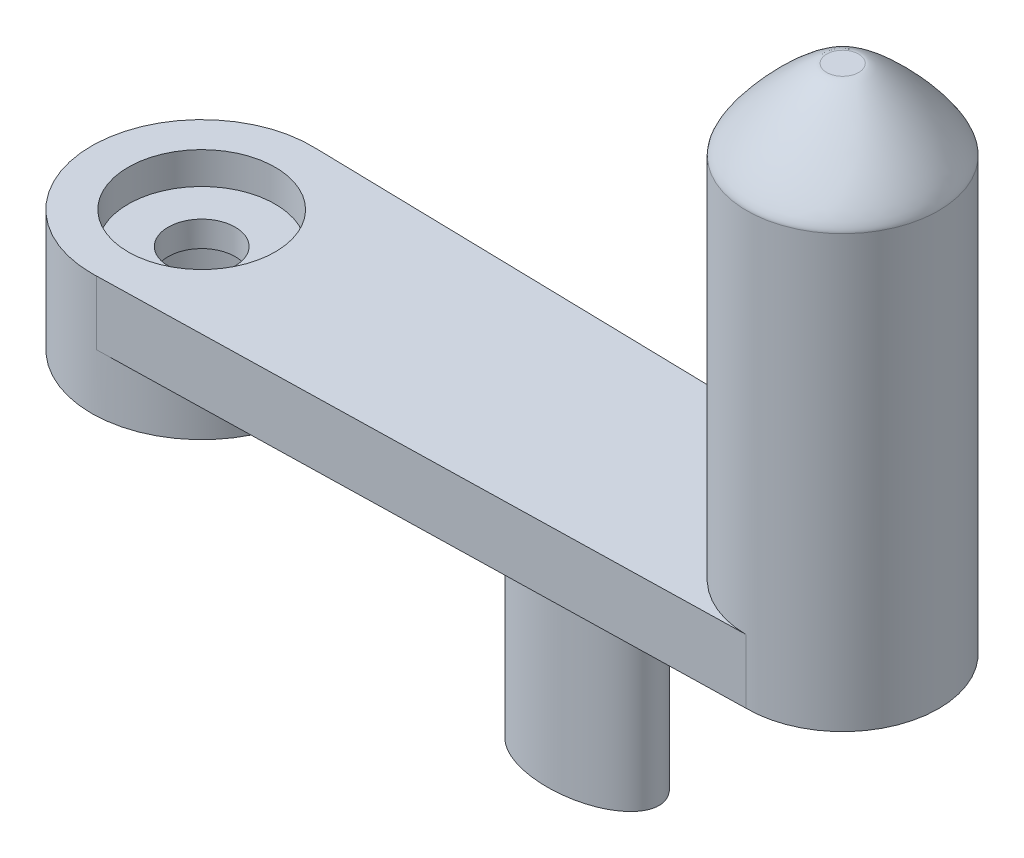
ISO-10303-21;
HEADER;
FILE_DESCRIPTION(('STEP AP214'),'2;1');
FILE_NAME('part.step','',(''),(''),'','','');
FILE_SCHEMA(('AUTOMOTIVE_DESIGN { 1 0 10303 214 1 1 1 1 }'));
ENDSEC;
DATA;
#1=APPLICATION_CONTEXT('core data for automotive mechanical design processes');
#2=APPLICATION_PROTOCOL_DEFINITION('international standard','automotive_design',2000,#1);
#3=PRODUCT_CONTEXT('',#1,'mechanical');
#4=PRODUCT('Part','Part','',(#3));
#5=PRODUCT_RELATED_PRODUCT_CATEGORY('part','',(#4));
#6=PRODUCT_DEFINITION_FORMATION('','',#4);
#7=PRODUCT_DEFINITION_CONTEXT('part definition',#1,'design');
#8=PRODUCT_DEFINITION('design','',#6,#7);
#9=PRODUCT_DEFINITION_SHAPE('','',#8);
#10=(LENGTH_UNIT() NAMED_UNIT(*) SI_UNIT(.MILLI.,.METRE.));
#11=(NAMED_UNIT(*) PLANE_ANGLE_UNIT() SI_UNIT($,.RADIAN.));
#12=(NAMED_UNIT(*) SI_UNIT($,.STERADIAN.) SOLID_ANGLE_UNIT());
#13=UNCERTAINTY_MEASURE_WITH_UNIT(LENGTH_MEASURE(1.E-05),#10,'distance_accuracy_value','');
#14=(GEOMETRIC_REPRESENTATION_CONTEXT(3) GLOBAL_UNCERTAINTY_ASSIGNED_CONTEXT((#13)) GLOBAL_UNIT_ASSIGNED_CONTEXT((#10,
#11,#12)) REPRESENTATION_CONTEXT('',''));
#15=CARTESIAN_POINT('',(0.,0.,0.));
#16=DIRECTION('',(0.,0.,1.));
#17=DIRECTION('',(1.,0.,0.));
#18=AXIS2_PLACEMENT_3D('',#15,#16,#17);
#19=CARTESIAN_POINT('',(0.,-1.4,0.));
#20=DIRECTION('',(0.,1.,0.));
#21=DIRECTION('',(0.,0.,1.));
#22=AXIS2_PLACEMENT_3D('',#19,#20,#21);
#23=CYLINDRICAL_SURFACE('',#22,3.45);
#24=DIRECTION('',(0.,1.,0.));
#25=VECTOR('',#24,1.);
#26=CARTESIAN_POINT('',(0.154910768884006,-2.,3.44652036896401));
#27=LINE('',#26,#25);
#28=CARTESIAN_POINT('',(0.154910768884006,-2.,3.44652036896401));
#29=VERTEX_POINT('',#28);
#30=CARTESIAN_POINT('',(0.154910768884006,0.,3.44652036896401));
#31=VERTEX_POINT('',#30);
#32=EDGE_CURVE('E82',#29,#31,#27,.T.);
#33=ORIENTED_EDGE('',*,*,#32,.T.);
#34=CARTESIAN_POINT('',(0.,0.,0.));
#35=DIRECTION('',(0.,1.,0.));
#36=DIRECTION('',(0.,0.,1.));
#37=AXIS2_PLACEMENT_3D('',#34,#35,#36);
#38=CIRCLE('',#37,3.45);
#39=CARTESIAN_POINT('',(0.154910768884048,0.,-3.44652036896399));
#40=VERTEX_POINT('',#39);
#41=EDGE_CURVE('E165',#40,#31,#38,.T.);
#42=ORIENTED_EDGE('',*,*,#41,.F.);
#43=DIRECTION('',(0.,1.,0.));
#44=VECTOR('',#43,1.);
#45=CARTESIAN_POINT('',(0.154910768884006,-2.,-3.446520368964));
#46=LINE('',#45,#44);
#47=CARTESIAN_POINT('',(0.154910768884006,-2.,-3.446520368964));
#48=VERTEX_POINT('',#47);
#49=EDGE_CURVE('E124',#48,#40,#46,.T.);
#50=ORIENTED_EDGE('',*,*,#49,.F.);
#51=CARTESIAN_POINT('',(0.,-2.,0.));
#52=DIRECTION('',(0.,1.,0.));
#53=DIRECTION('',(0.,0.,1.));
#54=AXIS2_PLACEMENT_3D('',#51,#52,#53);
#55=CIRCLE('',#54,3.45);
#56=EDGE_CURVE('E125',#29,#48,#55,.T.);
#57=ORIENTED_EDGE('',*,*,#56,.F.);
#58=EDGE_LOOP('',(#33,#42,#50,#57));
#59=FACE_BOUND('',#58,.T.);
#60=CARTESIAN_POINT('',(0.,-3.8,0.));
#61=DIRECTION('',(0.,1.,0.));
#62=DIRECTION('',(0.,0.,1.));
#63=AXIS2_PLACEMENT_3D('',#60,#61,#62);
#64=CIRCLE('',#63,3.45);
#65=CARTESIAN_POINT('',(0.,-3.8,3.45));
#66=VERTEX_POINT('',#65);
#67=EDGE_CURVE('E161',#66,#66,#64,.T.);
#68=ORIENTED_EDGE('',*,*,#67,.T.);
#69=EDGE_LOOP('',(#68));
#70=FACE_BOUND('',#69,.T.);
#71=ADVANCED_FACE('F51',(#59,#70),#23,.T.);
#72=CARTESIAN_POINT('',(0.,0.,0.));
#73=DIRECTION('',(0.,1.,0.));
#74=DIRECTION('',(0.,0.,1.));
#75=AXIS2_PLACEMENT_3D('',#72,#73,#74);
#76=PLANE('',#75);
#77=CARTESIAN_POINT('',(20.0673694973812,0.,0.));
#78=DIRECTION('',(0.,1.,0.));
#79=DIRECTION('',(0.,0.,1.));
#80=AXIS2_PLACEMENT_3D('',#77,#78,#79);
#81=CIRCLE('',#80,3.);
#82=CARTESIAN_POINT('',(20.0394661995052,0.,-2.99987023152129));
#83=VERTEX_POINT('',#82);
#84=CARTESIAN_POINT('',(20.0394661995052,0.,2.99987023152131));
#85=VERTEX_POINT('',#84);
#86=EDGE_CURVE('E97',#83,#85,#81,.T.);
#87=ORIENTED_EDGE('',*,*,#86,.F.);
#88=DIRECTION('',(0.999747821026361,0.,0.0224564991270473));
#89=VECTOR('',#88,1.);
#90=CARTESIAN_POINT('',(0.0774553844420066,0.,-3.44826018448199));
#91=LINE('',#90,#89);
#92=EDGE_CURVE('E73',#40,#83,#91,.T.);
#93=ORIENTED_EDGE('',*,*,#92,.F.);
#94=ORIENTED_EDGE('',*,*,#41,.T.);
#95=DIRECTION('',(0.999747821026361,0.,-0.0224564991270473));
#96=VECTOR('',#95,1.);
#97=CARTESIAN_POINT('',(0.0774553844420066,0.,3.44826018448201));
#98=LINE('',#97,#96);
#99=EDGE_CURVE('E91',#31,#85,#98,.T.);
#100=ORIENTED_EDGE('',*,*,#99,.T.);
#101=EDGE_LOOP('',(#87,#93,#94,#100));
#102=FACE_BOUND('',#101,.T.);
#103=CARTESIAN_POINT('',(0.,0.,0.));
#104=DIRECTION('',(0.,1.,0.));
#105=DIRECTION('',(0.,0.,1.));
#106=AXIS2_PLACEMENT_3D('',#103,#104,#105);
#107=CIRCLE('',#106,2.30000000000001);
#108=CARTESIAN_POINT('',(0.,0.,2.30000000000001));
#109=VERTEX_POINT('',#108);
#110=EDGE_CURVE('E145',#109,#109,#107,.T.);
#111=ORIENTED_EDGE('',*,*,#110,.F.);
#112=EDGE_LOOP('',(#111));
#113=FACE_BOUND('',#112,.T.);
#114=ADVANCED_FACE('F228',(#102,#113),#76,.T.);
#115=CARTESIAN_POINT('',(0.,-3.8,0.));
#116=DIRECTION('',(0.,1.,0.));
#117=DIRECTION('',(0.,0.,1.));
#118=AXIS2_PLACEMENT_3D('',#115,#116,#117);
#119=PLANE('',#118);
#120=CARTESIAN_POINT('',(0.,-3.8,0.));
#121=DIRECTION('',(0.,-1.,0.));
#122=DIRECTION('',(0.,0.,-1.));
#123=AXIS2_PLACEMENT_3D('',#120,#121,#122);
#124=CIRCLE('',#123,2.47500000000001);
#125=CARTESIAN_POINT('',(0.,-3.8,-2.47500000000001));
#126=VERTEX_POINT('',#125);
#127=EDGE_CURVE('E153',#126,#126,#124,.T.);
#128=ORIENTED_EDGE('',*,*,#127,.F.);
#129=EDGE_LOOP('',(#128));
#130=FACE_BOUND('',#129,.T.);
#131=ORIENTED_EDGE('',*,*,#67,.F.);
#132=EDGE_LOOP('',(#131));
#133=FACE_BOUND('',#132,.T.);
#134=ADVANCED_FACE('F224',(#130,#133),#119,.F.);
#135=CARTESIAN_POINT('',(0.,-1.8,0.));
#136=DIRECTION('',(0.,1.,0.));
#137=DIRECTION('',(0.,0.,1.));
#138=AXIS2_PLACEMENT_3D('',#135,#136,#137);
#139=PLANE('',#138);
#140=CARTESIAN_POINT('',(0.,-1.8,0.));
#141=DIRECTION('',(0.,1.,0.));
#142=DIRECTION('',(0.,0.,1.));
#143=AXIS2_PLACEMENT_3D('',#140,#141,#142);
#144=CIRCLE('',#143,1.05000000000001);
#145=CARTESIAN_POINT('',(0.,-1.8,1.05000000000001));
#146=VERTEX_POINT('',#145);
#147=EDGE_CURVE('E141',#146,#146,#144,.T.);
#148=ORIENTED_EDGE('',*,*,#147,.T.);
#149=EDGE_LOOP('',(#148));
#150=FACE_BOUND('',#149,.T.);
#151=CARTESIAN_POINT('',(0.,-1.8,0.));
#152=DIRECTION('',(0.,-1.,0.));
#153=DIRECTION('',(0.,0.,-1.));
#154=AXIS2_PLACEMENT_3D('',#151,#152,#153);
#155=CIRCLE('',#154,2.47500000000001);
#156=CARTESIAN_POINT('',(0.,-1.8,-2.47500000000001));
#157=VERTEX_POINT('',#156);
#158=EDGE_CURVE('E157',#157,#157,#155,.T.);
#159=ORIENTED_EDGE('',*,*,#158,.T.);
#160=EDGE_LOOP('',(#159));
#161=FACE_BOUND('',#160,.T.);
#162=ADVANCED_FACE('F220',(#150,#161),#139,.F.);
#163=CARTESIAN_POINT('',(0.,-3.8,0.));
#164=DIRECTION('',(0.,-1.,0.));
#165=DIRECTION('',(0.,0.,-1.));
#166=AXIS2_PLACEMENT_3D('',#163,#164,#165);
#167=CYLINDRICAL_SURFACE('',#166,2.47500000000001);
#168=ORIENTED_EDGE('',*,*,#158,.F.);
#169=EDGE_LOOP('',(#168));
#170=FACE_BOUND('',#169,.T.);
#171=ORIENTED_EDGE('',*,*,#127,.T.);
#172=EDGE_LOOP('',(#171));
#173=FACE_BOUND('',#172,.T.);
#174=ADVANCED_FACE('F216',(#170,#173),#167,.F.);
#175=CARTESIAN_POINT('',(0.,-1.,0.));
#176=DIRECTION('',(0.,-1.,0.));
#177=DIRECTION('',(0.,0.,-1.));
#178=AXIS2_PLACEMENT_3D('',#175,#176,#177);
#179=PLANE('',#178);
#180=CARTESIAN_POINT('',(0.,-1.,0.));
#181=DIRECTION('',(0.,-1.,0.));
#182=DIRECTION('',(0.,0.,-1.));
#183=AXIS2_PLACEMENT_3D('',#180,#181,#182);
#184=CIRCLE('',#183,1.05000000000001);
#185=CARTESIAN_POINT('',(0.,-1.,-1.05000000000001));
#186=VERTEX_POINT('',#185);
#187=EDGE_CURVE('E139',#186,#186,#184,.T.);
#188=ORIENTED_EDGE('',*,*,#187,.T.);
#189=EDGE_LOOP('',(#188));
#190=FACE_BOUND('',#189,.T.);
#191=CARTESIAN_POINT('',(0.,-1.,0.));
#192=DIRECTION('',(0.,1.,0.));
#193=DIRECTION('',(0.,0.,1.));
#194=AXIS2_PLACEMENT_3D('',#191,#192,#193);
#195=CIRCLE('',#194,2.30000000000001);
#196=CARTESIAN_POINT('',(0.,-1.,2.30000000000001));
#197=VERTEX_POINT('',#196);
#198=EDGE_CURVE('E149',#197,#197,#195,.T.);
#199=ORIENTED_EDGE('',*,*,#198,.T.);
#200=EDGE_LOOP('',(#199));
#201=FACE_BOUND('',#200,.T.);
#202=ADVANCED_FACE('F212',(#190,#201),#179,.F.);
#203=CARTESIAN_POINT('',(0.,0.,0.));
#204=DIRECTION('',(0.,1.,0.));
#205=DIRECTION('',(0.,0.,1.));
#206=AXIS2_PLACEMENT_3D('',#203,#204,#205);
#207=CYLINDRICAL_SURFACE('',#206,2.30000000000001);
#208=ORIENTED_EDGE('',*,*,#198,.F.);
#209=EDGE_LOOP('',(#208));
#210=FACE_BOUND('',#209,.T.);
#211=ORIENTED_EDGE('',*,*,#110,.T.);
#212=EDGE_LOOP('',(#211));
#213=FACE_BOUND('',#212,.T.);
#214=ADVANCED_FACE('F208',(#210,#213),#207,.F.);
#215=CARTESIAN_POINT('',(0.,0.,0.));
#216=DIRECTION('',(0.,1.,0.));
#217=DIRECTION('',(0.,0.,1.));
#218=AXIS2_PLACEMENT_3D('',#215,#216,#217);
#219=CYLINDRICAL_SURFACE('',#218,1.05000000000001);
#220=ORIENTED_EDGE('',*,*,#187,.F.);
#221=EDGE_LOOP('',(#220));
#222=FACE_BOUND('',#221,.T.);
#223=ORIENTED_EDGE('',*,*,#147,.F.);
#224=EDGE_LOOP('',(#223));
#225=FACE_BOUND('',#224,.T.);
#226=ADVANCED_FACE('F202',(#222,#225),#219,.F.);
#227=CARTESIAN_POINT('',(0.0774553844420066,-2.,3.44826018448201));
#228=DIRECTION('',(0.0224564991270473,0.,0.999747821026361));
#229=DIRECTION('',(0.999747821026361,0.,-0.0224564991270473));
#230=AXIS2_PLACEMENT_3D('',#227,#228,#229);
#231=PLANE('',#230);
#232=DIRECTION('',(0.,-1.,0.));
#233=VECTOR('',#232,1.);
#234=CARTESIAN_POINT('',(20.0394661995052,14.,2.9998702315213));
#235=LINE('',#234,#233);
#236=CARTESIAN_POINT('',(20.0394661995052,-2.,2.99987023152131));
#237=VERTEX_POINT('',#236);
#238=EDGE_CURVE('E104',#85,#237,#235,.T.);
#239=ORIENTED_EDGE('',*,*,#238,.F.);
#240=ORIENTED_EDGE('',*,*,#99,.F.);
#241=ORIENTED_EDGE('',*,*,#32,.F.);
#242=DIRECTION('',(0.999747821026361,0.,-0.0224564991270473));
#243=VECTOR('',#242,1.);
#244=CARTESIAN_POINT('',(0.0774553844420066,-2.,3.44826018448201));
#245=LINE('',#244,#243);
#246=EDGE_CURVE('E114',#29,#237,#245,.T.);
#247=ORIENTED_EDGE('',*,*,#246,.T.);
#248=EDGE_LOOP('',(#239,#240,#241,#247));
#249=FACE_BOUND('',#248,.T.);
#250=ADVANCED_FACE('F122',(#249),#231,.T.);
#251=CARTESIAN_POINT('',(0.0774553844420066,-2.,-3.44826018448199));
#252=DIRECTION('',(-0.0224564991270473,0.,0.999747821026361));
#253=DIRECTION('',(0.999747821026361,0.,0.0224564991270473));
#254=AXIS2_PLACEMENT_3D('',#251,#252,#253);
#255=PLANE('',#254);
#256=ORIENTED_EDGE('',*,*,#92,.T.);
#257=DIRECTION('',(0.,-1.,0.));
#258=VECTOR('',#257,1.);
#259=CARTESIAN_POINT('',(20.0394661995052,14.,-2.99987023152129));
#260=LINE('',#259,#258);
#261=CARTESIAN_POINT('',(20.0394661995052,-2.,-2.99987023152129));
#262=VERTEX_POINT('',#261);
#263=EDGE_CURVE('E119',#83,#262,#260,.T.);
#264=ORIENTED_EDGE('',*,*,#263,.T.);
#265=DIRECTION('',(0.999747821026361,0.,0.0224564991270473));
#266=VECTOR('',#265,1.);
#267=CARTESIAN_POINT('',(0.0774553844420066,-2.,-3.44826018448199));
#268=LINE('',#267,#266);
#269=EDGE_CURVE('E117',#48,#262,#268,.T.);
#270=ORIENTED_EDGE('',*,*,#269,.F.);
#271=ORIENTED_EDGE('',*,*,#49,.T.);
#272=EDGE_LOOP('',(#256,#264,#270,#271));
#273=FACE_BOUND('',#272,.T.);
#274=ADVANCED_FACE('F198',(#273),#255,.F.);
#275=CARTESIAN_POINT('',(0.,-2.,0.));
#276=DIRECTION('',(0.,1.,0.));
#277=DIRECTION('',(0.,0.,1.));
#278=AXIS2_PLACEMENT_3D('',#275,#276,#277);
#279=PLANE('',#278);
#280=CARTESIAN_POINT('',(12.0673694973812,-2.,0.));
#281=DIRECTION('',(0.,-1.,0.));
#282=DIRECTION('',(1.,0.,0.));
#283=AXIS2_PLACEMENT_3D('',#280,#281,#282);
#284=ELLIPSE('',#283,2.25,1.25);
#285=CARTESIAN_POINT('',(14.3173694973812,-2.,0.));
#286=VERTEX_POINT('',#285);
#287=EDGE_CURVE('E168',#286,#286,#284,.T.);
#288=ORIENTED_EDGE('',*,*,#287,.F.);
#289=EDGE_LOOP('',(#288));
#290=FACE_BOUND('',#289,.T.);
#291=ORIENTED_EDGE('',*,*,#269,.T.);
#292=CARTESIAN_POINT('',(20.0673694973812,-2.,0.));
#293=DIRECTION('',(0.,-1.,0.));
#294=DIRECTION('',(0.,0.,-1.));
#295=AXIS2_PLACEMENT_3D('',#292,#293,#294);
#296=CIRCLE('',#295,3.);
#297=EDGE_CURVE('E107',#262,#237,#296,.T.);
#298=ORIENTED_EDGE('',*,*,#297,.T.);
#299=ORIENTED_EDGE('',*,*,#246,.F.);
#300=ORIENTED_EDGE('',*,*,#56,.T.);
#301=EDGE_LOOP('',(#291,#298,#299,#300));
#302=FACE_BOUND('',#301,.T.);
#303=ADVANCED_FACE('F113',(#290,#302),#279,.F.);
#304=CARTESIAN_POINT('',(20.0673694973812,14.,0.));
#305=DIRECTION('',(0.,-1.,0.));
#306=DIRECTION('',(0.,0.,-1.));
#307=AXIS2_PLACEMENT_3D('',#304,#305,#306);
#308=CYLINDRICAL_SURFACE('',#307,3.);
#309=CARTESIAN_POINT('',(20.0673694973811,11.5,-3.));
#310=CARTESIAN_POINT('',(19.674670677482,11.5,-3.));
#311=CARTESIAN_POINT('',(19.2821256024319,11.5,-2.92191792981854));
#312=CARTESIAN_POINT('',(18.5565127981398,11.5,-2.62135926524918));
#313=CARTESIAN_POINT('',(18.2237291523361,11.5,-2.39900034207428));
#314=CARTESIAN_POINT('',(17.6683691553069,11.5,-1.84364034504499));
#315=CARTESIAN_POINT('',(17.4460102321321,11.5,-1.51085669924159));
#316=CARTESIAN_POINT('',(17.1454515675625,11.5,-0.785243894948932));
#317=CARTESIAN_POINT('',(17.0673694973811,11.5,-0.392698819899388));
#318=CARTESIAN_POINT('',(17.0673694973811,11.5,0.392698819899388));
#319=CARTESIAN_POINT('',(17.1454515675625,11.5,0.785243894948967));
#320=CARTESIAN_POINT('',(17.4460102321321,11.5,1.51085669924159));
#321=CARTESIAN_POINT('',(17.6683691553065,11.5,1.84364034504464));
#322=CARTESIAN_POINT('',(18.2237291523365,11.5,2.39900034207465));
#323=CARTESIAN_POINT('',(18.5565127981394,11.5,2.62135926524901));
#324=CARTESIAN_POINT('',(19.2821256024324,11.5,2.92191792981873));
#325=CARTESIAN_POINT('',(19.674670677482,11.5,3.00000000000001));
#326=CARTESIAN_POINT('',(20.4600683172804,11.5,3.00000000000001));
#327=CARTESIAN_POINT('',(20.8526133923304,11.5,2.92191792981854));
#328=CARTESIAN_POINT('',(21.5782261966225,11.5,2.62135926524919));
#329=CARTESIAN_POINT('',(21.9110098424258,11.5,2.39900034207467));
#330=CARTESIAN_POINT('',(22.4663698394558,11.5,1.84364034504464));
#331=CARTESIAN_POINT('',(22.6887287626302,11.5,1.51085669924159));
#332=CARTESIAN_POINT('',(22.9892874271998,11.5,0.785243894948974));
#333=CARTESIAN_POINT('',(23.0673694973811,11.5,0.392698819899388));
#334=CARTESIAN_POINT('',(23.0673694973811,11.5,-0.392698819899388));
#335=CARTESIAN_POINT('',(22.9892874271998,11.5,-0.785243894948953));
#336=CARTESIAN_POINT('',(22.6887287626302,11.5,-1.51085669924157));
#337=CARTESIAN_POINT('',(22.4663698394557,11.5,-1.84364034504469));
#338=CARTESIAN_POINT('',(21.9110098424259,11.5,-2.39900034207458));
#339=CARTESIAN_POINT('',(21.578226196623,11.5,-2.62135926524897));
#340=CARTESIAN_POINT('',(20.8526133923299,11.5,-2.92191792981875));
#341=CARTESIAN_POINT('',(20.4600683172803,11.5,-3.));
#342=CARTESIAN_POINT('',(20.0673694973811,11.5,-3.));
#343=(BOUNDED_CURVE() B_SPLINE_CURVE(3,(#309,#310,#311,#312,#313,#314,#315,#316,#317,#318,#319,
#320,#321,#322,#323,#324,#325,#326,#327,#328,#329,#330,#331,#332,#333,#334,#335,#336,#337,#338,
#339,#340,#341,#342),.UNSPECIFIED.,.T.,.F.) B_SPLINE_CURVE_WITH_KNOTS((4,2,2,2,2,2,2,2,2,2,2,2,
2,2,2,2,4),(0.,0.392699081698725,0.785398163397448,1.17809724509617,1.5707963267949,
1.96349540849362,2.35619449019234,2.74889357189107,3.14159265358979,3.53429173528852,
3.92699081698724,4.31968989868597,4.71238898038469,5.10508806208341,5.49778714378214,
5.89048622548086,6.28318530717959),
.UNSPECIFIED.) CURVE() GEOMETRIC_REPRESENTATION_ITEM() RATIONAL_B_SPLINE_CURVE((1.,1.,1.,1.,1.,
1.,1.,1.,1.,1.,1.,1.,1.,1.,1.,1.,1.,1.,1.,1.,1.,1.,1.,1.,1.,1.,1.,1.,1.,1.,1.,1.,1.,1.)) REPRESENTATION_ITEM(''));
#344=CARTESIAN_POINT('',(20.0673694973811,11.5,-3.));
#345=VERTEX_POINT('',#344);
#346=EDGE_CURVE('E66',#345,#345,#343,.F.);
#347=ORIENTED_EDGE('',*,*,#346,.T.);
#348=EDGE_LOOP('',(#347));
#349=FACE_BOUND('',#348,.T.);
#350=ORIENTED_EDGE('',*,*,#86,.T.);
#351=ORIENTED_EDGE('',*,*,#238,.T.);
#352=ORIENTED_EDGE('',*,*,#297,.F.);
#353=ORIENTED_EDGE('',*,*,#263,.F.);
#354=EDGE_LOOP('',(#350,#351,#352,#353));
#355=FACE_BOUND('',#354,.T.);
#356=ADVANCED_FACE('F106',(#349,#355),#308,.T.);
#357=CARTESIAN_POINT('',(20.0673694973812,14.,0.));
#358=DIRECTION('',(0.,-1.,0.));
#359=DIRECTION('',(0.,0.,-1.));
#360=AXIS2_PLACEMENT_3D('',#357,#358,#359);
#361=PLANE('',#360);
#362=CARTESIAN_POINT('',(20.0673694973811,14.,-0.499999999999994));
#363=CARTESIAN_POINT('',(20.1328193006977,14.,-0.499999999999994));
#364=CARTESIAN_POINT('',(20.1982434798726,14.,-0.486986321636441));
#365=CARTESIAN_POINT('',(20.3191789472548,14.,-0.436893210874839));
#366=CARTESIAN_POINT('',(20.3746428882219,14.,-0.399833390345737));
#367=CARTESIAN_POINT('',(20.467202887727,14.,-0.307273390840794));
#368=CARTESIAN_POINT('',(20.504262708256,14.,-0.251809449873602));
#369=CARTESIAN_POINT('',(20.5543558190176,14.,-0.130873982491481));
#370=CARTESIAN_POINT('',(20.5673694973811,14.,-0.0654498033165613));
#371=CARTESIAN_POINT('',(20.5673694973811,14.,0.0654498033165751));
#372=CARTESIAN_POINT('',(20.5543558190176,14.,0.130873982491488));
#373=CARTESIAN_POINT('',(20.504262708256,14.,0.251809449873609));
#374=CARTESIAN_POINT('',(20.4672028877269,14.,0.307273390840808));
#375=CARTESIAN_POINT('',(20.3746428882219,14.,0.399833390345751));
#376=CARTESIAN_POINT('',(20.3191789472547,14.,0.436893210874846));
#377=CARTESIAN_POINT('',(20.1982434798727,14.,0.486986321636448));
#378=CARTESIAN_POINT('',(20.1328193006977,14.,0.5));
#379=CARTESIAN_POINT('',(20.0019196940646,14.,0.5));
#380=CARTESIAN_POINT('',(19.9364955148897,14.,0.486986321636448));
#381=CARTESIAN_POINT('',(19.8155600475075,14.,0.436893210874853));
#382=CARTESIAN_POINT('',(19.7600961065404,14.,0.399833390345744));
#383=CARTESIAN_POINT('',(19.6675361070353,14.,0.307273390840808));
#384=CARTESIAN_POINT('',(19.6304762865063,14.,0.251809449873616));
#385=CARTESIAN_POINT('',(19.5803831757447,14.,0.130873982491488));
#386=CARTESIAN_POINT('',(19.5673694973812,14.,0.0654498033165682));
#387=CARTESIAN_POINT('',(19.5673694973812,14.,-0.0654498033165613));
#388=CARTESIAN_POINT('',(19.5803831757447,14.,-0.130873982491467));
#389=CARTESIAN_POINT('',(19.6304762865063,14.,-0.251809449873602));
#390=CARTESIAN_POINT('',(19.6675361070354,14.,-0.307273390840794));
#391=CARTESIAN_POINT('',(19.7600961065403,14.,-0.399833390345737));
#392=CARTESIAN_POINT('',(19.8155600475076,14.,-0.436893210874832));
#393=CARTESIAN_POINT('',(19.9364955148896,14.,-0.486986321636441));
#394=CARTESIAN_POINT('',(20.0019196940646,14.,-0.499999999999994));
#395=CARTESIAN_POINT('',(20.0673694973811,14.,-0.499999999999994));
#396=(BOUNDED_CURVE() B_SPLINE_CURVE(3,(#362,#363,#364,#365,#366,#367,#368,#369,#370,#371,#372,
#373,#374,#375,#376,#377,#378,#379,#380,#381,#382,#383,#384,#385,#386,#387,#388,#389,#390,#391,
#392,#393,#394,#395),.UNSPECIFIED.,.T.,.F.) B_SPLINE_CURVE_WITH_KNOTS((4,2,2,2,2,2,2,2,2,2,2,2,
2,2,2,2,4),(0.,0.392699081698724,0.785398163397448,1.17809724509617,1.5707963267949,
1.96349540849362,2.35619449019234,2.74889357189107,3.14159265358979,3.53429173528852,
3.92699081698724,4.31968989868597,4.71238898038469,5.10508806208341,5.49778714378214,
5.89048622548086,6.28318530717959),
.UNSPECIFIED.) CURVE() GEOMETRIC_REPRESENTATION_ITEM() RATIONAL_B_SPLINE_CURVE((1.,1.,1.,1.,1.,
1.,1.,1.,1.,1.,1.,1.,1.,1.,1.,1.,1.,1.,1.,1.,1.,1.,1.,1.,1.,1.,1.,1.,1.,1.,1.,1.,1.,1.)) REPRESENTATION_ITEM(''));
#397=CARTESIAN_POINT('',(20.0673694973811,14.,-0.499999999999994));
#398=VERTEX_POINT('',#397);
#399=EDGE_CURVE('E13',#398,#398,#396,.F.);
#400=ORIENTED_EDGE('',*,*,#399,.T.);
#401=EDGE_LOOP('',(#400));
#402=FACE_BOUND('',#401,.T.);
#403=ADVANCED_FACE('F193',(#402),#361,.F.);
#404=CARTESIAN_POINT('',(12.0673694973812,-9.00000000000001,0.));
#405=DIRECTION('',(0.,-1.,0.));
#406=DIRECTION('',(1.,0.,0.));
#407=AXIS2_PLACEMENT_3D('',#404,#405,#406);
#408=ELLIPSE('',#407,2.25,1.25);
#409=DIRECTION('',(0.,1.,0.));
#410=VECTOR('',#409,1.);
#411=SURFACE_OF_LINEAR_EXTRUSION('',#408,#410);
#412=CARTESIAN_POINT('',(14.3173694973812,-9.00000000000001,0.));
#413=VERTEX_POINT('',#412);
#414=EDGE_CURVE('E120',#413,#413,#408,.T.);
#415=ORIENTED_EDGE('',*,*,#414,.F.);
#416=EDGE_LOOP('',(#415));
#417=FACE_BOUND('',#416,.T.);
#418=ORIENTED_EDGE('',*,*,#287,.T.);
#419=EDGE_LOOP('',(#418));
#420=FACE_BOUND('',#419,.T.);
#421=ADVANCED_FACE('F251',(#417,#420),#411,.F.);
#422=CARTESIAN_POINT('',(12.0673694973812,-9.00000000000001,0.));
#423=DIRECTION('',(0.,-1.,0.));
#424=DIRECTION('',(0.,0.,-1.));
#425=AXIS2_PLACEMENT_3D('',#422,#423,#424);
#426=PLANE('',#425);
#427=ORIENTED_EDGE('',*,*,#414,.T.);
#428=EDGE_LOOP('',(#427));
#429=FACE_BOUND('',#428,.T.);
#430=ADVANCED_FACE('F254',(#429),#426,.T.);
#431=CARTESIAN_POINT('',(20.0673694973811,11.5,-3.));
#432=CARTESIAN_POINT('',(20.4600683172803,11.5,-3.));
#433=CARTESIAN_POINT('',(20.8526133923299,11.5,-2.92191792981875));
#434=CARTESIAN_POINT('',(21.578226196623,11.5,-2.62135926524897));
#435=CARTESIAN_POINT('',(21.9110098424259,11.5,-2.39900034207458));
#436=CARTESIAN_POINT('',(22.4663698394557,11.5,-1.84364034504469));
#437=CARTESIAN_POINT('',(22.6887287626302,11.5,-1.51085669924157));
#438=CARTESIAN_POINT('',(22.9892874271998,11.5,-0.785243894948953));
#439=CARTESIAN_POINT('',(23.0673694973811,11.5,-0.392698819899388));
#440=CARTESIAN_POINT('',(23.0673694973811,11.5,0.392698819899388));
#441=CARTESIAN_POINT('',(22.9892874271998,11.5,0.785243894948974));
#442=CARTESIAN_POINT('',(22.6887287626302,11.5,1.51085669924159));
#443=CARTESIAN_POINT('',(22.4663698394558,11.5,1.84364034504464));
#444=CARTESIAN_POINT('',(21.9110098424258,11.5,2.39900034207467));
#445=CARTESIAN_POINT('',(21.5782261966225,11.5,2.62135926524919));
#446=CARTESIAN_POINT('',(20.8526133923304,11.5,2.92191792981854));
#447=CARTESIAN_POINT('',(20.4600683172804,11.5,3.00000000000001));
#448=CARTESIAN_POINT('',(19.674670677482,11.5,3.00000000000001));
#449=CARTESIAN_POINT('',(19.2821256024324,11.5,2.92191792981873));
#450=CARTESIAN_POINT('',(18.5565127981394,11.5,2.62135926524901));
#451=CARTESIAN_POINT('',(18.2237291523365,11.5,2.39900034207465));
#452=CARTESIAN_POINT('',(17.6683691553065,11.5,1.84364034504464));
#453=CARTESIAN_POINT('',(17.4460102321321,11.5,1.51085669924159));
#454=CARTESIAN_POINT('',(17.1454515675625,11.5,0.785243894948967));
#455=CARTESIAN_POINT('',(17.0673694973811,11.5,0.392698819899388));
#456=CARTESIAN_POINT('',(17.0673694973811,11.5,-0.392698819899388));
#457=CARTESIAN_POINT('',(17.1454515675625,11.5,-0.785243894948932));
#458=CARTESIAN_POINT('',(17.4460102321321,11.5,-1.51085669924159));
#459=CARTESIAN_POINT('',(17.6683691553069,11.5,-1.84364034504499));
#460=CARTESIAN_POINT('',(18.2237291523361,11.5,-2.39900034207428));
#461=CARTESIAN_POINT('',(18.5565127981398,11.5,-2.62135926524918));
#462=CARTESIAN_POINT('',(19.2821256024319,11.5,-2.92191792981854));
#463=CARTESIAN_POINT('',(19.674670677482,11.5,-3.));
#464=CARTESIAN_POINT('',(20.0673694973811,11.5,-3.));
#465=CARTESIAN_POINT('',(20.0673694973811,14.,-3.00000000000001));
#466=CARTESIAN_POINT('',(20.4600683172803,13.9999999999999,-2.99999999999997));
#467=CARTESIAN_POINT('',(20.8526133923299,14.,-2.92191792981874));
#468=CARTESIAN_POINT('',(21.578226196623,14.,-2.62135926524896));
#469=CARTESIAN_POINT('',(21.9110098424259,14.,-2.39900034207459));
#470=CARTESIAN_POINT('',(22.4663698394557,14.,-1.84364034504468));
#471=CARTESIAN_POINT('',(22.6887287626304,14.,-1.51085669924158));
#472=CARTESIAN_POINT('',(22.9892874271996,14.,-0.785243894948947));
#473=CARTESIAN_POINT('',(23.0673694973811,14.,-0.392698819899389));
#474=CARTESIAN_POINT('',(23.0673694973811,14.,0.392698819899399));
#475=CARTESIAN_POINT('',(22.9892874271996,14.,0.785243894948947));
#476=CARTESIAN_POINT('',(22.6887287626304,14.,1.51085669924161));
#477=CARTESIAN_POINT('',(22.4663698394559,14.0000000000001,1.84364034504469));
#478=CARTESIAN_POINT('',(21.9110098424257,13.9999999999999,2.39900034207461));
#479=CARTESIAN_POINT('',(21.5782261966224,14.,2.62135926524917));
#480=CARTESIAN_POINT('',(20.8526133923304,14.,2.92191792981857));
#481=CARTESIAN_POINT('',(20.4600683172804,14.,3.00000000000001));
#482=CARTESIAN_POINT('',(19.6746706774819,14.,3.));
#483=CARTESIAN_POINT('',(19.2821256024324,14.,2.92191792981872));
#484=CARTESIAN_POINT('',(18.5565127981394,14.,2.621359265249));
#485=CARTESIAN_POINT('',(18.2237291523366,14.,2.39900034207461));
#486=CARTESIAN_POINT('',(17.6683691553064,14.,1.84364034504468));
#487=CARTESIAN_POINT('',(17.446010232132,14.,1.51085669924161));
#488=CARTESIAN_POINT('',(17.1454515675625,14.,0.785243894948937));
#489=CARTESIAN_POINT('',(17.0673694973811,14.,0.392698819899389));
#490=CARTESIAN_POINT('',(17.0673694973811,14.,-0.392698819899389));
#491=CARTESIAN_POINT('',(17.1454515675624,14.,-0.785243894948917));
#492=CARTESIAN_POINT('',(17.4460102321322,14.,-1.51085669924161));
#493=CARTESIAN_POINT('',(17.6683691553069,14.0000000000001,-1.84364034504498));
#494=CARTESIAN_POINT('',(18.2237291523361,13.9999999999999,-2.39900034207428));
#495=CARTESIAN_POINT('',(18.5565127981398,14.,-2.62135926524916));
#496=CARTESIAN_POINT('',(19.2821256024319,14.,-2.92191792981856));
#497=CARTESIAN_POINT('',(19.674670677482,14.0000000000001,-3.00000000000005));
#498=CARTESIAN_POINT('',(20.0673694973811,14.,-3.00000000000001));
#499=CARTESIAN_POINT('',(20.0673694973811,14.,-0.499999999999994));
#500=CARTESIAN_POINT('',(20.1328193006977,14.,-0.499999999999994));
#501=CARTESIAN_POINT('',(20.1982434798726,14.,-0.486986321636441));
#502=CARTESIAN_POINT('',(20.3191789472548,14.,-0.436893210874839));
#503=CARTESIAN_POINT('',(20.3746428882219,14.,-0.399833390345737));
#504=CARTESIAN_POINT('',(20.467202887727,14.,-0.307273390840794));
#505=CARTESIAN_POINT('',(20.504262708256,14.,-0.251809449873602));
#506=CARTESIAN_POINT('',(20.5543558190176,14.,-0.130873982491481));
#507=CARTESIAN_POINT('',(20.5673694973811,14.,-0.0654498033165613));
#508=CARTESIAN_POINT('',(20.5673694973811,14.,0.0654498033165751));
#509=CARTESIAN_POINT('',(20.5543558190176,14.,0.130873982491488));
#510=CARTESIAN_POINT('',(20.504262708256,14.,0.251809449873609));
#511=CARTESIAN_POINT('',(20.4672028877269,14.,0.307273390840808));
#512=CARTESIAN_POINT('',(20.3746428882219,14.,0.399833390345751));
#513=CARTESIAN_POINT('',(20.3191789472547,14.,0.436893210874846));
#514=CARTESIAN_POINT('',(20.1982434798727,14.,0.486986321636448));
#515=CARTESIAN_POINT('',(20.1328193006977,14.,0.5));
#516=CARTESIAN_POINT('',(20.0019196940646,14.,0.5));
#517=CARTESIAN_POINT('',(19.9364955148897,14.,0.486986321636448));
#518=CARTESIAN_POINT('',(19.8155600475075,14.,0.436893210874853));
#519=CARTESIAN_POINT('',(19.7600961065404,14.,0.399833390345744));
#520=CARTESIAN_POINT('',(19.6675361070353,14.,0.307273390840808));
#521=CARTESIAN_POINT('',(19.6304762865063,14.,0.251809449873616));
#522=CARTESIAN_POINT('',(19.5803831757447,14.,0.130873982491488));
#523=CARTESIAN_POINT('',(19.5673694973812,14.,0.0654498033165682));
#524=CARTESIAN_POINT('',(19.5673694973812,14.,-0.0654498033165613));
#525=CARTESIAN_POINT('',(19.5803831757447,14.,-0.130873982491467));
#526=CARTESIAN_POINT('',(19.6304762865063,14.,-0.251809449873602));
#527=CARTESIAN_POINT('',(19.6675361070354,14.,-0.307273390840794));
#528=CARTESIAN_POINT('',(19.7600961065403,14.,-0.399833390345737));
#529=CARTESIAN_POINT('',(19.8155600475076,14.,-0.436893210874832));
#530=CARTESIAN_POINT('',(19.9364955148896,14.,-0.486986321636441));
#531=CARTESIAN_POINT('',(20.0019196940646,14.,-0.499999999999994));
#532=CARTESIAN_POINT('',(20.0673694973811,14.,-0.499999999999994));
#533=(BOUNDED_SURFACE() B_SPLINE_SURFACE(2,3,((#431,#432,#433,#434,#435,#436,#437,#438,#439,
#440,#441,#442,#443,#444,#445,#446,#447,#448,#449,#450,#451,#452,#453,#454,#455,#456,#457,#458,
#459,#460,#461,#462,#463,#464),(#465,#466,#467,#468,#469,#470,#471,#472,#473,#474,#475,#476,
#477,#478,#479,#480,#481,#482,#483,#484,#485,#486,#487,#488,#489,#490,#491,#492,#493,#494,#495,
#496,#497,#498),(#499,#500,#501,#502,#503,#504,#505,#506,#507,#508,#509,#510,#511,#512,#513,
#514,#515,#516,#517,#518,#519,#520,#521,#522,#523,#524,#525,#526,#527,#528,#529,#530,#531,
#532)),.UNSPECIFIED.,.F.,.T.,.F.) B_SPLINE_SURFACE_WITH_KNOTS((3,3),(4,2,2,2,2,2,2,2,2,2,2,2,2,
2,2,2,4),(0.,1.),(0.,0.392699081698724,0.785398163397448,1.17809724509617,1.5707963267949,
1.96349540849362,2.35619449019234,2.74889357189107,3.14159265358979,3.53429173528852,
3.92699081698724,4.31968989868597,4.71238898038469,5.10508806208341,5.49778714378214,
5.89048622548086,6.28318530717959),
.UNSPECIFIED.) GEOMETRIC_REPRESENTATION_ITEM() RATIONAL_B_SPLINE_SURFACE(((1.,1.,1.,1.,1.,1.,1.,
1.,1.,1.,1.,1.,1.,1.,1.,1.,1.,1.,1.,1.,1.,1.,1.,1.,1.,1.,1.,1.,1.,1.,1.,1.,1.,1.),
(0.176470588235294,0.176470588235294,0.176470588235294,0.176470588235294,0.176470588235294,
0.176470588235294,0.176470588235294,0.176470588235294,0.176470588235294,0.176470588235294,
0.176470588235294,0.176470588235294,0.176470588235294,0.176470588235294,0.176470588235294,
0.176470588235294,0.176470588235294,0.176470588235294,0.176470588235294,0.176470588235294,
0.176470588235294,0.176470588235294,0.176470588235294,0.176470588235294,0.176470588235294,
0.176470588235294,0.176470588235294,0.176470588235294,0.176470588235294,0.176470588235294,
0.176470588235294,0.176470588235294,0.176470588235294,0.176470588235294),(1.,1.,1.,1.,1.,1.,1.,
1.,1.,1.,1.,1.,1.,1.,1.,1.,1.,1.,1.,1.,1.,1.,1.,1.,1.,1.,1.,1.,1.,1.,1.,1.,1.,1.))) REPRESENTATION_ITEM('') SURFACE());
#534=ORIENTED_EDGE('',*,*,#399,.F.);
#535=EDGE_LOOP('',(#534));
#536=FACE_BOUND('',#535,.T.);
#537=ORIENTED_EDGE('',*,*,#346,.F.);
#538=EDGE_LOOP('',(#537));
#539=FACE_BOUND('',#538,.T.);
#540=ADVANCED_FACE('F54',(#536,#539),#533,.T.);
#541=CLOSED_SHELL('',(#71,#114,#134,#162,#174,#202,#214,#226,#250,#274,#303,#356,#403,#421,#430,#540));
#542=MANIFOLD_SOLID_BREP('B2',#541);
#543=ADVANCED_BREP_SHAPE_REPRESENTATION('',(#18,#542),#14);
#544=SHAPE_DEFINITION_REPRESENTATION(#9,#543);
ENDSEC;
END-ISO-10303-21;
